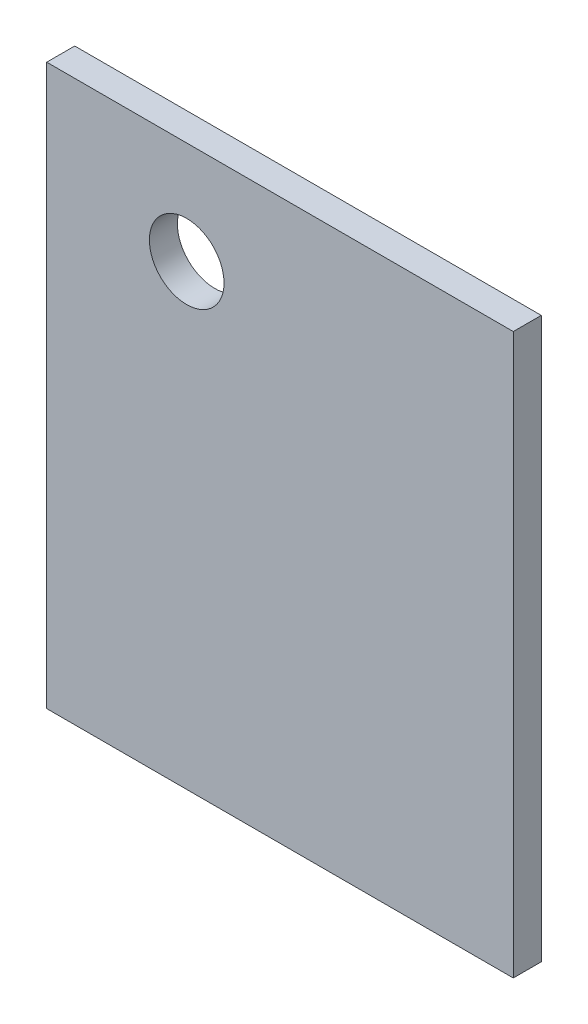
ISO-10303-21;
HEADER;
FILE_DESCRIPTION(('STEP AP214'),'2;1');
FILE_NAME('part.step','',(''),(''),'','','');
FILE_SCHEMA(('AUTOMOTIVE_DESIGN { 1 0 10303 214 1 1 1 1 }'));
ENDSEC;
DATA;
#1=APPLICATION_CONTEXT('core data for automotive mechanical design processes');
#2=APPLICATION_PROTOCOL_DEFINITION('international standard','automotive_design',2000,#1);
#3=PRODUCT_CONTEXT('',#1,'mechanical');
#4=PRODUCT('Part','Part','',(#3));
#5=PRODUCT_RELATED_PRODUCT_CATEGORY('part','',(#4));
#6=PRODUCT_DEFINITION_FORMATION('','',#4);
#7=PRODUCT_DEFINITION_CONTEXT('part definition',#1,'design');
#8=PRODUCT_DEFINITION('design','',#6,#7);
#9=PRODUCT_DEFINITION_SHAPE('','',#8);
#10=(LENGTH_UNIT() NAMED_UNIT(*) SI_UNIT(.MILLI.,.METRE.));
#11=(NAMED_UNIT(*) PLANE_ANGLE_UNIT() SI_UNIT($,.RADIAN.));
#12=(NAMED_UNIT(*) SI_UNIT($,.STERADIAN.) SOLID_ANGLE_UNIT());
#13=UNCERTAINTY_MEASURE_WITH_UNIT(LENGTH_MEASURE(1.E-05),#10,'distance_accuracy_value','');
#14=(GEOMETRIC_REPRESENTATION_CONTEXT(3) GLOBAL_UNCERTAINTY_ASSIGNED_CONTEXT((#13)) GLOBAL_UNIT_ASSIGNED_CONTEXT((#10,
#11,#12)) REPRESENTATION_CONTEXT('',''));
#15=CARTESIAN_POINT('',(0.,0.,0.));
#16=DIRECTION('',(0.,0.,1.));
#17=DIRECTION('',(1.,0.,0.));
#18=AXIS2_PLACEMENT_3D('',#15,#16,#17);
#19=CARTESIAN_POINT('',(0.,0.,3.));
#20=DIRECTION('',(0.,0.,-1.));
#21=DIRECTION('',(-1.,0.,0.));
#22=AXIS2_PLACEMENT_3D('',#19,#20,#21);
#23=PLANE('',#22);
#24=DIRECTION('',(0.,1.,0.));
#25=VECTOR('',#24,1.);
#26=CARTESIAN_POINT('',(25.,-30.,3.));
#27=LINE('',#26,#25);
#28=CARTESIAN_POINT('',(25.,-30.,3.));
#29=VERTEX_POINT('',#28);
#30=CARTESIAN_POINT('',(25.,30.,3.));
#31=VERTEX_POINT('',#30);
#32=EDGE_CURVE('E85',#29,#31,#27,.T.);
#33=ORIENTED_EDGE('',*,*,#32,.T.);
#34=DIRECTION('',(-1.,0.,0.));
#35=VECTOR('',#34,1.);
#36=CARTESIAN_POINT('',(-25.,30.,3.));
#37=LINE('',#36,#35);
#38=CARTESIAN_POINT('',(-25.,30.,3.));
#39=VERTEX_POINT('',#38);
#40=EDGE_CURVE('E80',#31,#39,#37,.T.);
#41=ORIENTED_EDGE('',*,*,#40,.T.);
#42=DIRECTION('',(0.,-1.,0.));
#43=VECTOR('',#42,1.);
#44=CARTESIAN_POINT('',(-25.,-30.,3.));
#45=LINE('',#44,#43);
#46=CARTESIAN_POINT('',(-25.,-30.,3.));
#47=VERTEX_POINT('',#46);
#48=EDGE_CURVE('E83',#39,#47,#45,.T.);
#49=ORIENTED_EDGE('',*,*,#48,.T.);
#50=DIRECTION('',(1.,0.,0.));
#51=VECTOR('',#50,1.);
#52=CARTESIAN_POINT('',(-25.,-30.,3.));
#53=LINE('',#52,#51);
#54=EDGE_CURVE('E50',#47,#29,#53,.T.);
#55=ORIENTED_EDGE('',*,*,#54,.T.);
#56=EDGE_LOOP('',(#33,#41,#49,#55));
#57=FACE_BOUND('',#56,.T.);
#58=CARTESIAN_POINT('',(-10.,19.,3.));
#59=DIRECTION('',(0.,0.,1.));
#60=DIRECTION('',(1.,0.,0.));
#61=AXIS2_PLACEMENT_3D('',#58,#59,#60);
#62=CIRCLE('',#61,4.);
#63=CARTESIAN_POINT('',(-6.,19.,3.));
#64=VERTEX_POINT('',#63);
#65=EDGE_CURVE('E100',#64,#64,#62,.T.);
#66=ORIENTED_EDGE('',*,*,#65,.F.);
#67=EDGE_LOOP('',(#66));
#68=FACE_BOUND('',#67,.T.);
#69=ADVANCED_FACE('F33',(#57,#68),#23,.F.);
#70=CARTESIAN_POINT('',(0.,0.,0.));
#71=DIRECTION('',(0.,0.,-1.));
#72=DIRECTION('',(-1.,0.,0.));
#73=AXIS2_PLACEMENT_3D('',#70,#71,#72);
#74=PLANE('',#73);
#75=DIRECTION('',(0.,1.,0.));
#76=VECTOR('',#75,1.);
#77=CARTESIAN_POINT('',(25.,-30.,0.));
#78=LINE('',#77,#76);
#79=CARTESIAN_POINT('',(25.,-30.,0.));
#80=VERTEX_POINT('',#79);
#81=CARTESIAN_POINT('',(25.,30.,0.));
#82=VERTEX_POINT('',#81);
#83=EDGE_CURVE('E97',#80,#82,#78,.T.);
#84=ORIENTED_EDGE('',*,*,#83,.F.);
#85=DIRECTION('',(1.,0.,0.));
#86=VECTOR('',#85,1.);
#87=CARTESIAN_POINT('',(-25.,-30.,0.));
#88=LINE('',#87,#86);
#89=CARTESIAN_POINT('',(-25.,-30.,0.));
#90=VERTEX_POINT('',#89);
#91=EDGE_CURVE('E73',#90,#80,#88,.T.);
#92=ORIENTED_EDGE('',*,*,#91,.F.);
#93=DIRECTION('',(0.,-1.,0.));
#94=VECTOR('',#93,1.);
#95=CARTESIAN_POINT('',(-25.,-30.,0.));
#96=LINE('',#95,#94);
#97=CARTESIAN_POINT('',(-25.,30.,0.));
#98=VERTEX_POINT('',#97);
#99=EDGE_CURVE('E67',#98,#90,#96,.T.);
#100=ORIENTED_EDGE('',*,*,#99,.F.);
#101=DIRECTION('',(-1.,0.,0.));
#102=VECTOR('',#101,1.);
#103=CARTESIAN_POINT('',(-25.,30.,0.));
#104=LINE('',#103,#102);
#105=EDGE_CURVE('E89',#82,#98,#104,.T.);
#106=ORIENTED_EDGE('',*,*,#105,.F.);
#107=EDGE_LOOP('',(#84,#92,#100,#106));
#108=FACE_BOUND('',#107,.T.);
#109=CARTESIAN_POINT('',(-10.,19.,0.));
#110=DIRECTION('',(0.,0.,1.));
#111=DIRECTION('',(1.,0.,0.));
#112=AXIS2_PLACEMENT_3D('',#109,#110,#111);
#113=CIRCLE('',#112,4.);
#114=CARTESIAN_POINT('',(-6.,19.,0.));
#115=VERTEX_POINT('',#114);
#116=EDGE_CURVE('E112',#115,#115,#113,.T.);
#117=ORIENTED_EDGE('',*,*,#116,.T.);
#118=EDGE_LOOP('',(#117));
#119=FACE_BOUND('',#118,.T.);
#120=ADVANCED_FACE('F108',(#108,#119),#74,.T.);
#121=CARTESIAN_POINT('',(25.,-30.,3.));
#122=DIRECTION('',(-1.,0.,0.));
#123=DIRECTION('',(0.,0.,1.));
#124=AXIS2_PLACEMENT_3D('',#121,#122,#123);
#125=PLANE('',#124);
#126=ORIENTED_EDGE('',*,*,#83,.T.);
#127=DIRECTION('',(0.,0.,-1.));
#128=VECTOR('',#127,1.);
#129=CARTESIAN_POINT('',(25.,30.,3.));
#130=LINE('',#129,#128);
#131=EDGE_CURVE('E11',#31,#82,#130,.T.);
#132=ORIENTED_EDGE('',*,*,#131,.F.);
#133=ORIENTED_EDGE('',*,*,#32,.F.);
#134=DIRECTION('',(0.,0.,-1.));
#135=VECTOR('',#134,1.);
#136=CARTESIAN_POINT('',(25.,-30.,3.));
#137=LINE('',#136,#135);
#138=EDGE_CURVE('E93',#29,#80,#137,.T.);
#139=ORIENTED_EDGE('',*,*,#138,.T.);
#140=EDGE_LOOP('',(#126,#132,#133,#139));
#141=FACE_BOUND('',#140,.T.);
#142=ADVANCED_FACE('F35',(#141),#125,.F.);
#143=CARTESIAN_POINT('',(-25.,30.,3.));
#144=DIRECTION('',(0.,-1.,0.));
#145=DIRECTION('',(0.,0.,-1.));
#146=AXIS2_PLACEMENT_3D('',#143,#144,#145);
#147=PLANE('',#146);
#148=ORIENTED_EDGE('',*,*,#105,.T.);
#149=DIRECTION('',(0.,0.,-1.));
#150=VECTOR('',#149,1.);
#151=CARTESIAN_POINT('',(-25.,30.,3.));
#152=LINE('',#151,#150);
#153=EDGE_CURVE('E42',#39,#98,#152,.T.);
#154=ORIENTED_EDGE('',*,*,#153,.F.);
#155=ORIENTED_EDGE('',*,*,#40,.F.);
#156=ORIENTED_EDGE('',*,*,#131,.T.);
#157=EDGE_LOOP('',(#148,#154,#155,#156));
#158=FACE_BOUND('',#157,.T.);
#159=ADVANCED_FACE('F88',(#158),#147,.F.);
#160=CARTESIAN_POINT('',(-25.,-30.,3.));
#161=DIRECTION('',(1.,0.,0.));
#162=DIRECTION('',(0.,0.,-1.));
#163=AXIS2_PLACEMENT_3D('',#160,#161,#162);
#164=PLANE('',#163);
#165=ORIENTED_EDGE('',*,*,#99,.T.);
#166=DIRECTION('',(0.,0.,-1.));
#167=VECTOR('',#166,1.);
#168=CARTESIAN_POINT('',(-25.,-30.,3.));
#169=LINE('',#168,#167);
#170=EDGE_CURVE('E90',#47,#90,#169,.T.);
#171=ORIENTED_EDGE('',*,*,#170,.F.);
#172=ORIENTED_EDGE('',*,*,#48,.F.);
#173=ORIENTED_EDGE('',*,*,#153,.T.);
#174=EDGE_LOOP('',(#165,#171,#172,#173));
#175=FACE_BOUND('',#174,.T.);
#176=ADVANCED_FACE('F91',(#175),#164,.F.);
#177=CARTESIAN_POINT('',(-25.,-30.,3.));
#178=DIRECTION('',(0.,1.,0.));
#179=DIRECTION('',(0.,0.,1.));
#180=AXIS2_PLACEMENT_3D('',#177,#178,#179);
#181=PLANE('',#180);
#182=ORIENTED_EDGE('',*,*,#91,.T.);
#183=ORIENTED_EDGE('',*,*,#138,.F.);
#184=ORIENTED_EDGE('',*,*,#54,.F.);
#185=ORIENTED_EDGE('',*,*,#170,.T.);
#186=EDGE_LOOP('',(#182,#183,#184,#185));
#187=FACE_BOUND('',#186,.T.);
#188=ADVANCED_FACE('F105',(#187),#181,.F.);
#189=CARTESIAN_POINT('',(-10.,19.,3.));
#190=DIRECTION('',(0.,0.,-1.));
#191=DIRECTION('',(-1.,0.,0.));
#192=AXIS2_PLACEMENT_3D('',#189,#190,#191);
#193=CYLINDRICAL_SURFACE('',#192,4.);
#194=ORIENTED_EDGE('',*,*,#65,.T.);
#195=EDGE_LOOP('',(#194));
#196=FACE_BOUND('',#195,.T.);
#197=ORIENTED_EDGE('',*,*,#116,.F.);
#198=EDGE_LOOP('',(#197));
#199=FACE_BOUND('',#198,.T.);
#200=ADVANCED_FACE('F118',(#196,#199),#193,.F.);
#201=CLOSED_SHELL('',(#69,#120,#142,#159,#176,#188,#200));
#202=MANIFOLD_SOLID_BREP('B2',#201);
#203=ADVANCED_BREP_SHAPE_REPRESENTATION('',(#18,#202),#14);
#204=SHAPE_DEFINITION_REPRESENTATION(#9,#203);
ENDSEC;
END-ISO-10303-21;
